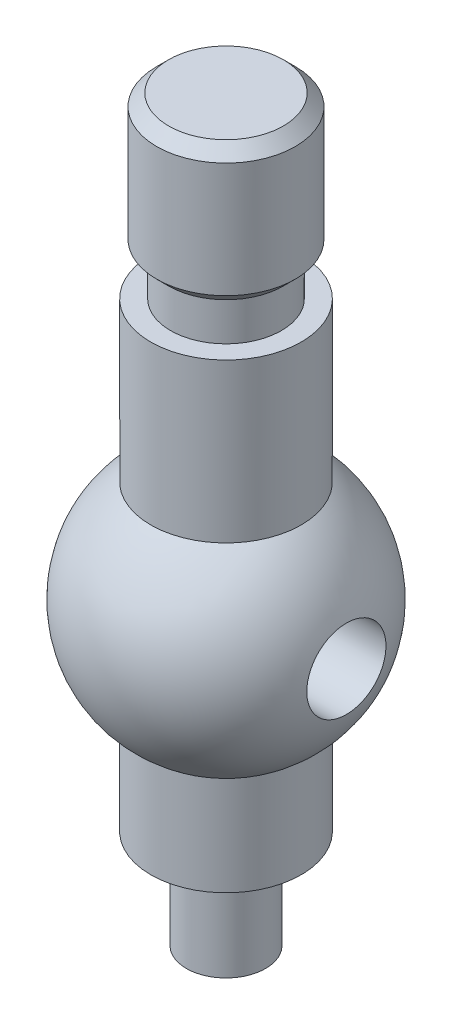
ISO-10303-21;
HEADER;
FILE_DESCRIPTION(('STEP AP214'),'2;1');
FILE_NAME('part.step','',(''),(''),'','','');
FILE_SCHEMA(('AUTOMOTIVE_DESIGN { 1 0 10303 214 1 1 1 1 }'));
ENDSEC;
DATA;
#1=APPLICATION_CONTEXT('core data for automotive mechanical design processes');
#2=APPLICATION_PROTOCOL_DEFINITION('international standard','automotive_design',2000,#1);
#3=PRODUCT_CONTEXT('',#1,'mechanical');
#4=PRODUCT('Part','Part','',(#3));
#5=PRODUCT_RELATED_PRODUCT_CATEGORY('part','',(#4));
#6=PRODUCT_DEFINITION_FORMATION('','',#4);
#7=PRODUCT_DEFINITION_CONTEXT('part definition',#1,'design');
#8=PRODUCT_DEFINITION('design','',#6,#7);
#9=PRODUCT_DEFINITION_SHAPE('','',#8);
#10=(LENGTH_UNIT() NAMED_UNIT(*) SI_UNIT(.MILLI.,.METRE.));
#11=(NAMED_UNIT(*) PLANE_ANGLE_UNIT() SI_UNIT($,.RADIAN.));
#12=(NAMED_UNIT(*) SI_UNIT($,.STERADIAN.) SOLID_ANGLE_UNIT());
#13=UNCERTAINTY_MEASURE_WITH_UNIT(LENGTH_MEASURE(1.E-05),#10,'distance_accuracy_value','');
#14=(GEOMETRIC_REPRESENTATION_CONTEXT(3) GLOBAL_UNCERTAINTY_ASSIGNED_CONTEXT((#13)) GLOBAL_UNIT_ASSIGNED_CONTEXT((#10,
#11,#12)) REPRESENTATION_CONTEXT('',''));
#15=CARTESIAN_POINT('',(0.,0.,0.));
#16=DIRECTION('',(0.,0.,1.));
#17=DIRECTION('',(1.,0.,0.));
#18=AXIS2_PLACEMENT_3D('',#15,#16,#17);
#19=CARTESIAN_POINT('',(-0.875,11.0748786379167,0.));
#20=DIRECTION('',(0.,1.,0.));
#21=DIRECTION('',(0.,0.,1.));
#22=AXIS2_PLACEMENT_3D('',#19,#20,#21);
#23=PLANE('',#22);
#24=CARTESIAN_POINT('',(0.,11.0748786380555,0.));
#25=DIRECTION('',(0.,-1.,0.));
#26=DIRECTION('',(0.,0.,-1.));
#27=AXIS2_PLACEMENT_3D('',#24,#25,#26);
#28=CIRCLE('',#27,1.45000000009077);
#29=CARTESIAN_POINT('',(0.,11.0748786380555,-1.45000000009077));
#30=VERTEX_POINT('',#29);
#31=EDGE_CURVE('E18',#30,#30,#28,.T.);
#32=ORIENTED_EDGE('',*,*,#31,.F.);
#33=EDGE_LOOP('',(#32));
#34=FACE_BOUND('',#33,.T.);
#35=ADVANCED_FACE('F15',(#34),#23,.T.);
#36=CARTESIAN_POINT('',(0.,10.7748786379034,0.));
#37=DIRECTION('',(0.,-1.,0.));
#38=DIRECTION('',(0.,0.,-1.));
#39=AXIS2_PLACEMENT_3D('',#36,#37,#38);
#40=CONICAL_SURFACE('',#39,1.74999999978809,0.785398162639536);
#41=ORIENTED_EDGE('',*,*,#31,.T.);
#42=EDGE_LOOP('',(#41));
#43=FACE_BOUND('',#42,.T.);
#44=CARTESIAN_POINT('',(0.,10.7748786379167,0.));
#45=DIRECTION('',(0.,1.,0.));
#46=DIRECTION('',(0.,0.,1.));
#47=AXIS2_PLACEMENT_3D('',#44,#45,#46);
#48=CIRCLE('',#47,1.75);
#49=CARTESIAN_POINT('',(0.,10.7748786379167,1.75));
#50=VERTEX_POINT('',#49);
#51=EDGE_CURVE('E57',#50,#50,#48,.F.);
#52=ORIENTED_EDGE('',*,*,#51,.F.);
#53=EDGE_LOOP('',(#52));
#54=FACE_BOUND('',#53,.T.);
#55=ADVANCED_FACE('F119',(#43,#54),#40,.T.);
#56=CARTESIAN_POINT('',(0.,8.82487863791674,0.));
#57=DIRECTION('',(0.,1.,0.));
#58=DIRECTION('',(0.,0.,1.));
#59=AXIS2_PLACEMENT_3D('',#56,#57,#58);
#60=CYLINDRICAL_SURFACE('',#59,1.75);
#61=CARTESIAN_POINT('',(0.,7.87487863806291,0.));
#62=DIRECTION('',(0.,1.,0.));
#63=DIRECTION('',(-1.,0.,0.));
#64=AXIS2_PLACEMENT_3D('',#61,#62,#63);
#65=CIRCLE('',#64,1.74999999984493);
#66=CARTESIAN_POINT('',(-1.74999999984493,7.87487863806291,0.));
#67=VERTEX_POINT('',#66);
#68=EDGE_CURVE('E53',#67,#67,#65,.F.);
#69=ORIENTED_EDGE('',*,*,#68,.F.);
#70=EDGE_LOOP('',(#69));
#71=FACE_BOUND('',#70,.T.);
#72=ORIENTED_EDGE('',*,*,#51,.T.);
#73=EDGE_LOOP('',(#72));
#74=FACE_BOUND('',#73,.T.);
#75=ADVANCED_FACE('F117',(#71,#74),#60,.T.);
#76=CARTESIAN_POINT('',(0.,7.87487863806291,0.));
#77=DIRECTION('',(0.,1.,0.));
#78=DIRECTION('',(0.,0.,1.));
#79=AXIS2_PLACEMENT_3D('',#76,#77,#78);
#80=CONICAL_SURFACE('',#79,1.74999999984493,0.785398162544797);
#81=ORIENTED_EDGE('',*,*,#68,.T.);
#82=EDGE_LOOP('',(#81));
#83=FACE_BOUND('',#82,.T.);
#84=CARTESIAN_POINT('',(0.,7.574878637854,0.));
#85=DIRECTION('',(0.,1.,0.));
#86=DIRECTION('',(0.,0.,1.));
#87=AXIS2_PLACEMENT_3D('',#84,#85,#86);
#88=CIRCLE('',#87,1.45000000014761);
#89=CARTESIAN_POINT('',(0.,7.574878637854,1.45000000014761));
#90=VERTEX_POINT('',#89);
#91=EDGE_CURVE('E51',#90,#90,#88,.T.);
#92=ORIENTED_EDGE('',*,*,#91,.T.);
#93=EDGE_LOOP('',(#92));
#94=FACE_BOUND('',#93,.T.);
#95=ADVANCED_FACE('F113',(#83,#94),#80,.T.);
#96=CARTESIAN_POINT('',(0.,7.57487863791675,2.66803887936012));
#97=DIRECTION('',(0.,1.,0.));
#98=DIRECTION('',(0.,0.,1.));
#99=AXIS2_PLACEMENT_3D('',#96,#97,#98);
#100=PLANE('',#99);
#101=CARTESIAN_POINT('',(0.,7.57487863791675,0.));
#102=DIRECTION('',(0.,-1.,0.));
#103=DIRECTION('',(0.,0.,-1.));
#104=AXIS2_PLACEMENT_3D('',#101,#102,#103);
#105=CIRCLE('',#104,1.4);
#106=CARTESIAN_POINT('',(0.,7.57487863791675,-1.4));
#107=VERTEX_POINT('',#106);
#108=EDGE_CURVE('E49',#107,#107,#105,.T.);
#109=ORIENTED_EDGE('',*,*,#108,.F.);
#110=EDGE_LOOP('',(#109));
#111=FACE_BOUND('',#110,.T.);
#112=ORIENTED_EDGE('',*,*,#91,.F.);
#113=EDGE_LOOP('',(#112));
#114=FACE_BOUND('',#113,.T.);
#115=ADVANCED_FACE('F109',(#111,#114),#100,.F.);
#116=CARTESIAN_POINT('',(-0.5,-7.57487863791675,0.));
#117=DIRECTION('',(0.,-1.,0.));
#118=DIRECTION('',(0.,0.,-1.));
#119=AXIS2_PLACEMENT_3D('',#116,#117,#118);
#120=PLANE('',#119);
#121=CARTESIAN_POINT('',(0.,-7.57487863791675,0.));
#122=DIRECTION('',(0.,1.,0.));
#123=DIRECTION('',(0.,0.,1.));
#124=AXIS2_PLACEMENT_3D('',#121,#122,#123);
#125=CIRCLE('',#124,1.);
#126=CARTESIAN_POINT('',(0.,-7.57487863791675,1.));
#127=VERTEX_POINT('',#126);
#128=EDGE_CURVE('E46',#127,#127,#125,.T.);
#129=ORIENTED_EDGE('',*,*,#128,.F.);
#130=EDGE_LOOP('',(#129));
#131=FACE_BOUND('',#130,.T.);
#132=ADVANCED_FACE('F105',(#131),#120,.T.);
#133=CARTESIAN_POINT('',(0.,7.07487863791675,0.));
#134=DIRECTION('',(0.,-1.,0.));
#135=DIRECTION('',(0.,0.,-1.));
#136=AXIS2_PLACEMENT_3D('',#133,#134,#135);
#137=CYLINDRICAL_SURFACE('',#136,1.4);
#138=CARTESIAN_POINT('',(0.,6.57487863791675,0.));
#139=DIRECTION('',(0.,-1.,0.));
#140=DIRECTION('',(0.,0.,-1.));
#141=AXIS2_PLACEMENT_3D('',#138,#139,#140);
#142=CIRCLE('',#141,1.4);
#143=CARTESIAN_POINT('',(0.,6.57487863791675,-1.4));
#144=VERTEX_POINT('',#143);
#145=EDGE_CURVE('E43',#144,#144,#142,.T.);
#146=ORIENTED_EDGE('',*,*,#145,.F.);
#147=EDGE_LOOP('',(#146));
#148=FACE_BOUND('',#147,.T.);
#149=ORIENTED_EDGE('',*,*,#108,.T.);
#150=EDGE_LOOP('',(#149));
#151=FACE_BOUND('',#150,.T.);
#152=ADVANCED_FACE('F101',(#148,#151),#137,.T.);
#153=CARTESIAN_POINT('',(0.,-6.32487863791675,0.));
#154=DIRECTION('',(0.,1.,0.));
#155=DIRECTION('',(0.,0.,1.));
#156=AXIS2_PLACEMENT_3D('',#153,#154,#155);
#157=CYLINDRICAL_SURFACE('',#156,1.);
#158=ORIENTED_EDGE('',*,*,#128,.T.);
#159=EDGE_LOOP('',(#158));
#160=FACE_BOUND('',#159,.T.);
#161=CARTESIAN_POINT('',(0.,-5.07487863791675,0.));
#162=DIRECTION('',(0.,1.,0.));
#163=DIRECTION('',(0.,0.,1.));
#164=AXIS2_PLACEMENT_3D('',#161,#162,#163);
#165=CIRCLE('',#164,1.);
#166=CARTESIAN_POINT('',(0.,-5.07487863791675,1.));
#167=VERTEX_POINT('',#166);
#168=EDGE_CURVE('E40',#167,#167,#165,.T.);
#169=ORIENTED_EDGE('',*,*,#168,.F.);
#170=EDGE_LOOP('',(#169));
#171=FACE_BOUND('',#170,.T.);
#172=ADVANCED_FACE('F97',(#160,#171),#157,.T.);
#173=CARTESIAN_POINT('',(-1.825,6.57487863791675,0.));
#174=DIRECTION('',(0.,1.,0.));
#175=DIRECTION('',(0.,0.,1.));
#176=AXIS2_PLACEMENT_3D('',#173,#174,#175);
#177=PLANE('',#176);
#178=ORIENTED_EDGE('',*,*,#145,.T.);
#179=EDGE_LOOP('',(#178));
#180=FACE_BOUND('',#179,.T.);
#181=CARTESIAN_POINT('',(0.,6.57487863791675,0.));
#182=DIRECTION('',(0.,1.,0.));
#183=DIRECTION('',(0.,0.,1.));
#184=AXIS2_PLACEMENT_3D('',#181,#182,#183);
#185=CIRCLE('',#184,1.9);
#186=CARTESIAN_POINT('',(0.,6.57487863791675,1.9));
#187=VERTEX_POINT('',#186);
#188=EDGE_CURVE('E37',#187,#187,#185,.F.);
#189=ORIENTED_EDGE('',*,*,#188,.F.);
#190=EDGE_LOOP('',(#189));
#191=FACE_BOUND('',#190,.T.);
#192=ADVANCED_FACE('F93',(#180,#191),#177,.T.);
#193=CARTESIAN_POINT('',(-1.45,-5.07487863791675,0.));
#194=DIRECTION('',(0.,-1.,0.));
#195=DIRECTION('',(0.,0.,-1.));
#196=AXIS2_PLACEMENT_3D('',#193,#194,#195);
#197=PLANE('',#196);
#198=ORIENTED_EDGE('',*,*,#168,.T.);
#199=EDGE_LOOP('',(#198));
#200=FACE_BOUND('',#199,.T.);
#201=CARTESIAN_POINT('',(0.,-5.07487863791675,0.));
#202=DIRECTION('',(0.,1.,0.));
#203=DIRECTION('',(0.,0.,1.));
#204=AXIS2_PLACEMENT_3D('',#201,#202,#203);
#205=CIRCLE('',#204,1.9);
#206=CARTESIAN_POINT('',(0.,-5.07487863791675,1.9));
#207=VERTEX_POINT('',#206);
#208=EDGE_CURVE('E33',#207,#207,#205,.T.);
#209=ORIENTED_EDGE('',*,*,#208,.F.);
#210=EDGE_LOOP('',(#209));
#211=FACE_BOUND('',#210,.T.);
#212=ADVANCED_FACE('F89',(#200,#211),#197,.T.);
#213=CARTESIAN_POINT('',(0.,0.,0.));
#214=DIRECTION('',(-1.,0.,0.));
#215=DIRECTION('',(0.,0.,1.));
#216=AXIS2_PLACEMENT_3D('',#213,#214,#215);
#217=CYLINDRICAL_SURFACE('',#216,1.);
#218=CARTESIAN_POINT('',(3.03973683071413,0.,0.));
#219=DIRECTION('',(1.,0.,0.));
#220=DIRECTION('',(0.,1.,0.));
#221=AXIS2_PLACEMENT_3D('',#218,#219,#220);
#222=CIRCLE('',#221,1.);
#223=CARTESIAN_POINT('',(3.03973683071413,1.,0.));
#224=VERTEX_POINT('',#223);
#225=EDGE_CURVE('E27',#224,#224,#222,.F.);
#226=ORIENTED_EDGE('',*,*,#225,.F.);
#227=EDGE_LOOP('',(#226));
#228=FACE_BOUND('',#227,.T.);
#229=CARTESIAN_POINT('',(-3.03973683071414,0.,0.));
#230=DIRECTION('',(1.,0.,0.));
#231=DIRECTION('',(0.,1.,0.));
#232=AXIS2_PLACEMENT_3D('',#229,#230,#231);
#233=CIRCLE('',#232,0.999999999999999);
#234=CARTESIAN_POINT('',(-3.03973683071414,0.999999999999999,0.));
#235=VERTEX_POINT('',#234);
#236=EDGE_CURVE('E36',#235,#235,#233,.T.);
#237=ORIENTED_EDGE('',*,*,#236,.F.);
#238=EDGE_LOOP('',(#237));
#239=FACE_BOUND('',#238,.T.);
#240=ADVANCED_FACE('F85',(#228,#239),#217,.F.);
#241=CARTESIAN_POINT('',(0.,4.57487863791675,0.));
#242=DIRECTION('',(0.,1.,0.));
#243=DIRECTION('',(0.,0.,1.));
#244=AXIS2_PLACEMENT_3D('',#241,#242,#243);
#245=CYLINDRICAL_SURFACE('',#244,1.9);
#246=CARTESIAN_POINT('',(0.,2.57487863791675,0.));
#247=DIRECTION('',(0.,1.,0.));
#248=DIRECTION('',(0.,0.,1.));
#249=AXIS2_PLACEMENT_3D('',#246,#247,#248);
#250=CIRCLE('',#249,1.9);
#251=CARTESIAN_POINT('',(0.,2.57487863791675,1.9));
#252=VERTEX_POINT('',#251);
#253=EDGE_CURVE('E22',#252,#252,#250,.F.);
#254=ORIENTED_EDGE('',*,*,#253,.F.);
#255=EDGE_LOOP('',(#254));
#256=FACE_BOUND('',#255,.T.);
#257=ORIENTED_EDGE('',*,*,#188,.T.);
#258=EDGE_LOOP('',(#257));
#259=FACE_BOUND('',#258,.T.);
#260=ADVANCED_FACE('F81',(#256,#259),#245,.T.);
#261=CARTESIAN_POINT('',(0.,-3.82487863791675,0.));
#262=DIRECTION('',(0.,1.,0.));
#263=DIRECTION('',(0.,0.,1.));
#264=AXIS2_PLACEMENT_3D('',#261,#262,#263);
#265=CYLINDRICAL_SURFACE('',#264,1.9);
#266=ORIENTED_EDGE('',*,*,#208,.T.);
#267=EDGE_LOOP('',(#266));
#268=FACE_BOUND('',#267,.T.);
#269=CARTESIAN_POINT('',(0.,-2.57487863791675,0.));
#270=DIRECTION('',(0.,1.,0.));
#271=DIRECTION('',(0.,0.,1.));
#272=AXIS2_PLACEMENT_3D('',#269,#270,#271);
#273=CIRCLE('',#272,1.9);
#274=CARTESIAN_POINT('',(0.,-2.57487863791675,1.9));
#275=VERTEX_POINT('',#274);
#276=EDGE_CURVE('E10',#275,#275,#273,.T.);
#277=ORIENTED_EDGE('',*,*,#276,.F.);
#278=EDGE_LOOP('',(#277));
#279=FACE_BOUND('',#278,.T.);
#280=ADVANCED_FACE('F78',(#268,#279),#265,.T.);
#281=CARTESIAN_POINT('',(0.,0.,0.));
#282=DIRECTION('',(1.,0.,0.));
#283=DIRECTION('',(0.,1.,0.));
#284=AXIS2_PLACEMENT_3D('',#281,#282,#283);
#285=SPHERICAL_SURFACE('',#284,3.2);
#286=ORIENTED_EDGE('',*,*,#276,.T.);
#287=EDGE_LOOP('',(#286));
#288=FACE_BOUND('',#287,.T.);
#289=ORIENTED_EDGE('',*,*,#253,.T.);
#290=EDGE_LOOP('',(#289));
#291=FACE_BOUND('',#290,.T.);
#292=ORIENTED_EDGE('',*,*,#225,.T.);
#293=EDGE_LOOP('',(#292));
#294=FACE_BOUND('',#293,.T.);
#295=ORIENTED_EDGE('',*,*,#236,.T.);
#296=EDGE_LOOP('',(#295));
#297=FACE_BOUND('',#296,.T.);
#298=ADVANCED_FACE('F75',(#288,#291,#294,#297),#285,.T.);
#299=CLOSED_SHELL('',(#35,#55,#75,#95,#115,#132,#152,#172,#192,#212,#240,#260,#280,#298));
#300=MANIFOLD_SOLID_BREP('B1',#299);
#301=ADVANCED_BREP_SHAPE_REPRESENTATION('',(#18,#300),#14);
#302=SHAPE_DEFINITION_REPRESENTATION(#9,#301);
ENDSEC;
END-ISO-10303-21;
